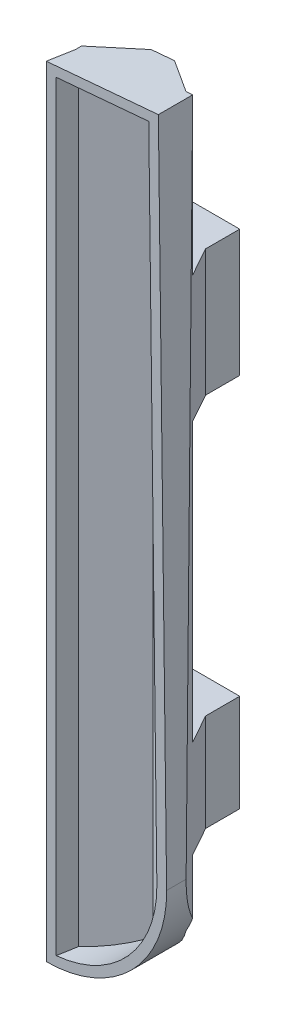
ISO-10303-21;
HEADER;
FILE_DESCRIPTION(('STEP AP214'),'2;1');
FILE_NAME('part.step','',(''),(''),'','','');
FILE_SCHEMA(('AUTOMOTIVE_DESIGN { 1 0 10303 214 1 1 1 1 }'));
ENDSEC;
DATA;
#1=APPLICATION_CONTEXT('core data for automotive mechanical design processes');
#2=APPLICATION_PROTOCOL_DEFINITION('international standard','automotive_design',2000,#1);
#3=PRODUCT_CONTEXT('',#1,'mechanical');
#4=PRODUCT('Part','Part','',(#3));
#5=PRODUCT_RELATED_PRODUCT_CATEGORY('part','',(#4));
#6=PRODUCT_DEFINITION_FORMATION('','',#4);
#7=PRODUCT_DEFINITION_CONTEXT('part definition',#1,'design');
#8=PRODUCT_DEFINITION('design','',#6,#7);
#9=PRODUCT_DEFINITION_SHAPE('','',#8);
#10=(LENGTH_UNIT() NAMED_UNIT(*) SI_UNIT(.MILLI.,.METRE.));
#11=(NAMED_UNIT(*) PLANE_ANGLE_UNIT() SI_UNIT($,.RADIAN.));
#12=(NAMED_UNIT(*) SI_UNIT($,.STERADIAN.) SOLID_ANGLE_UNIT());
#13=UNCERTAINTY_MEASURE_WITH_UNIT(LENGTH_MEASURE(1.E-05),#10,'distance_accuracy_value','');
#14=(GEOMETRIC_REPRESENTATION_CONTEXT(3) GLOBAL_UNCERTAINTY_ASSIGNED_CONTEXT((#13)) GLOBAL_UNIT_ASSIGNED_CONTEXT((#10,
#11,#12)) REPRESENTATION_CONTEXT('',''));
#15=CARTESIAN_POINT('',(0.,0.,0.));
#16=DIRECTION('',(0.,0.,1.));
#17=DIRECTION('',(1.,0.,0.));
#18=AXIS2_PLACEMENT_3D('',#15,#16,#17);
#19=CARTESIAN_POINT('',(1.,162.012239261096,-5.));
#20=DIRECTION('',(-1.,0.,0.));
#21=DIRECTION('',(0.,0.,1.));
#22=AXIS2_PLACEMENT_3D('',#19,#20,#21);
#23=PLANE('',#22);
#24=DIRECTION('',(0.,0.,-1.));
#25=VECTOR('',#24,1.);
#26=CARTESIAN_POINT('',(1.,27.0122392610962,-5.));
#27=LINE('',#26,#25);
#28=CARTESIAN_POINT('',(1.,27.0122392610962,-6.23485994175354));
#29=VERTEX_POINT('',#28);
#30=CARTESIAN_POINT('',(1.,27.0122392610962,-20.));
#31=VERTEX_POINT('',#30);
#32=EDGE_CURVE('E530',#29,#31,#27,.T.);
#33=ORIENTED_EDGE('',*,*,#32,.F.);
#34=DIRECTION('',(0.,1.,0.));
#35=VECTOR('',#34,1.);
#36=CARTESIAN_POINT('',(1.,0.,-6.23485994175354));
#37=LINE('',#36,#35);
#38=CARTESIAN_POINT('',(1.,0.0202554186842924,-6.23485994175354));
#39=VERTEX_POINT('',#38);
#40=EDGE_CURVE('E320',#39,#29,#37,.T.);
#41=ORIENTED_EDGE('',*,*,#40,.F.);
#42=DIRECTION('',(0.,0.,1.));
#43=VECTOR('',#42,1.);
#44=CARTESIAN_POINT('',(1.,0.0202554186842889,-20.));
#45=LINE('',#44,#43);
#46=CARTESIAN_POINT('',(1.,0.0202554186842785,-5.));
#47=VERTEX_POINT('',#46);
#48=EDGE_CURVE('E574',#47,#39,#45,.F.);
#49=ORIENTED_EDGE('',*,*,#48,.F.);
#50=DIRECTION('',(0.,-1.,0.));
#51=VECTOR('',#50,1.);
#52=CARTESIAN_POINT('',(1.,162.012239261096,-5.));
#53=LINE('',#52,#51);
#54=CARTESIAN_POINT('',(1.,160.087488663526,-5.));
#55=VERTEX_POINT('',#54);
#56=EDGE_CURVE('E556',#55,#47,#53,.T.);
#57=ORIENTED_EDGE('',*,*,#56,.F.);
#58=DIRECTION('',(0.,0.,1.));
#59=VECTOR('',#58,1.);
#60=CARTESIAN_POINT('',(1.,160.087488663526,-20.));
#61=LINE('',#60,#59);
#62=CARTESIAN_POINT('',(1.,160.087488663526,-6.23485994175354));
#63=VERTEX_POINT('',#62);
#64=EDGE_CURVE('E571',#63,#55,#61,.T.);
#65=ORIENTED_EDGE('',*,*,#64,.F.);
#66=DIRECTION('',(0.,-1.,0.));
#67=VECTOR('',#66,1.);
#68=CARTESIAN_POINT('',(1.,162.012264261096,-6.23485994175354));
#69=LINE('',#68,#67);
#70=CARTESIAN_POINT('',(1.,130.012239261096,-6.23485994175354));
#71=VERTEX_POINT('',#70);
#72=EDGE_CURVE('E389',#63,#71,#69,.T.);
#73=ORIENTED_EDGE('',*,*,#72,.T.);
#74=DIRECTION('',(0.,0.,1.));
#75=VECTOR('',#74,1.);
#76=CARTESIAN_POINT('',(1.,130.012239261096,-5.));
#77=LINE('',#76,#75);
#78=CARTESIAN_POINT('',(1.,130.012239261096,-20.));
#79=VERTEX_POINT('',#78);
#80=EDGE_CURVE('E552',#79,#71,#77,.T.);
#81=ORIENTED_EDGE('',*,*,#80,.F.);
#82=DIRECTION('',(0.,1.,0.));
#83=VECTOR('',#82,1.);
#84=CARTESIAN_POINT('',(1.,24.6948803571772,-20.));
#85=LINE('',#84,#83);
#86=CARTESIAN_POINT('',(1.,104.012239261096,-20.));
#87=VERTEX_POINT('',#86);
#88=EDGE_CURVE('E793',#87,#79,#85,.T.);
#89=ORIENTED_EDGE('',*,*,#88,.F.);
#90=DIRECTION('',(0.,0.,-1.));
#91=VECTOR('',#90,1.);
#92=CARTESIAN_POINT('',(1.,104.012239261096,-5.));
#93=LINE('',#92,#91);
#94=CARTESIAN_POINT('',(1.,104.012239261096,-6.23485994175354));
#95=VERTEX_POINT('',#94);
#96=EDGE_CURVE('E542',#95,#87,#93,.T.);
#97=ORIENTED_EDGE('',*,*,#96,.F.);
#98=DIRECTION('',(0.,-1.,0.));
#99=VECTOR('',#98,1.);
#100=CARTESIAN_POINT('',(1.,114.298896639428,-6.23485994175354));
#101=LINE('',#100,#99);
#102=CARTESIAN_POINT('',(1.,47.0122392610962,-6.23485994175354));
#103=VERTEX_POINT('',#102);
#104=EDGE_CURVE('E347',#95,#103,#101,.T.);
#105=ORIENTED_EDGE('',*,*,#104,.T.);
#106=DIRECTION('',(0.,0.,1.));
#107=VECTOR('',#106,1.);
#108=CARTESIAN_POINT('',(1.,47.0122392610962,-5.));
#109=LINE('',#108,#107);
#110=CARTESIAN_POINT('',(1.,47.0122392610962,-20.));
#111=VERTEX_POINT('',#110);
#112=EDGE_CURVE('E536',#111,#103,#109,.T.);
#113=ORIENTED_EDGE('',*,*,#112,.F.);
#114=EDGE_CURVE('E779',#31,#111,#85,.T.);
#115=ORIENTED_EDGE('',*,*,#114,.F.);
#116=EDGE_LOOP('',(#33,#41,#49,#57,#65,#73,#81,#89,#97,#105,#113,#115));
#117=FACE_BOUND('',#116,.T.);
#118=ADVANCED_FACE('F88',(#117),#23,.T.);
#119=CARTESIAN_POINT('',(19.6929953197027,162.012239261096,-13.));
#120=DIRECTION('',(0.874157276121538,0.,-0.485642931178632));
#121=DIRECTION('',(-0.485642931178632,0.,-0.874157276121538));
#122=AXIS2_PLACEMENT_3D('',#119,#120,#121);
#123=PLANE('',#122);
#124=CARTESIAN_POINT('',(0.,24.6948803571772,-48.4473915754649));
#125=DIRECTION('',(0.874157276121538,0.,-0.485642931178632));
#126=DIRECTION('',(0.485642931178632,0.,0.874157276121538));
#127=AXIS2_PLACEMENT_3D('',#124,#125,#126);
#128=ELLIPSE('',#127,50.8498709066843,24.6948803571772);
#129=CARTESIAN_POINT('',(23.,15.7039340301604,-7.04739157546487));
#130=VERTEX_POINT('',#129);
#131=CARTESIAN_POINT('',(24.6929953197027,24.3897607143542,-4.));
#132=VERTEX_POINT('',#131);
#133=EDGE_CURVE('E325',#130,#132,#128,.F.);
#134=ORIENTED_EDGE('',*,*,#133,.F.);
#135=DIRECTION('',(0.,1.,0.));
#136=VECTOR('',#135,1.);
#137=CARTESIAN_POINT('',(23.,0.,-7.04739157546487));
#138=LINE('',#137,#136);
#139=CARTESIAN_POINT('',(23.,27.0122392610962,-7.04739157546487));
#140=VERTEX_POINT('',#139);
#141=EDGE_CURVE('E316',#130,#140,#138,.T.);
#142=ORIENTED_EDGE('',*,*,#141,.T.);
#143=DIRECTION('',(0.485642931178632,0.,0.874157276121538));
#144=VECTOR('',#143,1.);
#145=CARTESIAN_POINT('',(19.6929953197027,27.0122392610962,-13.));
#146=LINE('',#145,#144);
#147=CARTESIAN_POINT('',(19.6929953197027,27.0122392610962,-13.));
#148=VERTEX_POINT('',#147);
#149=EDGE_CURVE('E300',#148,#140,#146,.T.);
#150=ORIENTED_EDGE('',*,*,#149,.F.);
#151=DIRECTION('',(0.,-1.,0.));
#152=VECTOR('',#151,1.);
#153=CARTESIAN_POINT('',(19.6929953197027,162.012239261096,-13.));
#154=LINE('',#153,#152);
#155=CARTESIAN_POINT('',(19.6929953197027,47.0122392610962,-13.));
#156=VERTEX_POINT('',#155);
#157=EDGE_CURVE('E555',#156,#148,#154,.T.);
#158=ORIENTED_EDGE('',*,*,#157,.F.);
#159=DIRECTION('',(-0.485642931178632,0.,-0.874157276121538));
#160=VECTOR('',#159,1.);
#161=CARTESIAN_POINT('',(19.6929953197027,47.0122392610962,-13.));
#162=LINE('',#161,#160);
#163=CARTESIAN_POINT('',(23.,47.0122392610962,-7.04739157546487));
#164=VERTEX_POINT('',#163);
#165=EDGE_CURVE('E311',#164,#156,#162,.T.);
#166=ORIENTED_EDGE('',*,*,#165,.F.);
#167=DIRECTION('',(0.,-1.,0.));
#168=VECTOR('',#167,1.);
#169=CARTESIAN_POINT('',(23.,114.298896639428,-7.04739157546487));
#170=LINE('',#169,#168);
#171=CARTESIAN_POINT('',(23.,104.012239261096,-7.04739157546487));
#172=VERTEX_POINT('',#171);
#173=EDGE_CURVE('E352',#172,#164,#170,.T.);
#174=ORIENTED_EDGE('',*,*,#173,.F.);
#175=DIRECTION('',(0.485642931178632,0.,0.874157276121538));
#176=VECTOR('',#175,1.);
#177=CARTESIAN_POINT('',(19.6929953197027,104.012239261096,-13.));
#178=LINE('',#177,#176);
#179=CARTESIAN_POINT('',(19.6929953197027,104.012239261096,-13.));
#180=VERTEX_POINT('',#179);
#181=EDGE_CURVE('E810',#180,#172,#178,.T.);
#182=ORIENTED_EDGE('',*,*,#181,.F.);
#183=CARTESIAN_POINT('',(19.6929953197027,130.012239261096,-13.));
#184=VERTEX_POINT('',#183);
#185=EDGE_CURVE('E561',#184,#180,#154,.T.);
#186=ORIENTED_EDGE('',*,*,#185,.F.);
#187=DIRECTION('',(-0.485642931178632,0.,-0.874157276121538));
#188=VECTOR('',#187,1.);
#189=CARTESIAN_POINT('',(19.6929953197027,130.012239261096,-13.));
#190=LINE('',#189,#188);
#191=CARTESIAN_POINT('',(23.,130.012239261096,-7.04739157546487));
#192=VERTEX_POINT('',#191);
#193=EDGE_CURVE('E756',#192,#184,#190,.T.);
#194=ORIENTED_EDGE('',*,*,#193,.F.);
#195=DIRECTION('',(0.,-1.,0.));
#196=VECTOR('',#195,1.);
#197=CARTESIAN_POINT('',(23.,162.012264261096,-7.04739157546487));
#198=LINE('',#197,#196);
#199=CARTESIAN_POINT('',(23.,162.012239261096,-7.04739157546487));
#200=VERTEX_POINT('',#199);
#201=EDGE_CURVE('E402',#200,#192,#198,.T.);
#202=ORIENTED_EDGE('',*,*,#201,.F.);
#203=DIRECTION('',(-0.012352528430367,0.999676467551096,-0.0222345511746607));
#204=VECTOR('',#203,1.);
#205=CARTESIAN_POINT('',(22.9964425282031,162.300141520089,-7.05379502469935));
#206=LINE('',#205,#204);
#207=CARTESIAN_POINT('',(24.6929953197027,25.0000000000002,-4.));
#208=VERTEX_POINT('',#207);
#209=EDGE_CURVE('E770',#208,#200,#206,.T.);
#210=ORIENTED_EDGE('',*,*,#209,.F.);
#211=CARTESIAN_POINT('',(0.,24.6948803571772,-4.));
#212=DIRECTION('',(0.,0.,1.));
#213=DIRECTION('',(0.999923666871545,-0.0123555829552469,0.));
#214=AXIS2_PLACEMENT_3D('',#211,#212,#213);
#215=CIRCLE('',#214,24.6948803571772);
#216=EDGE_CURVE('E312',#132,#208,#215,.T.);
#217=ORIENTED_EDGE('',*,*,#216,.F.);
#218=EDGE_LOOP('',(#134,#142,#150,#158,#166,#174,#182,#186,#194,#202,#210,#217));
#219=FACE_BOUND('',#218,.T.);
#220=ADVANCED_FACE('F323',(#219),#123,.T.);
#221=CARTESIAN_POINT('',(0.,24.6948803571772,-20.));
#222=DIRECTION('',(0.,0.,1.));
#223=DIRECTION('',(1.,0.,0.));
#224=AXIS2_PLACEMENT_3D('',#221,#222,#223);
#225=CYLINDRICAL_SURFACE('',#224,24.6948803571772);
#226=CARTESIAN_POINT('',(0.,24.6948803571772,-21.6865750091522));
#227=DIRECTION('',(0.560448340623305,0.,-0.828189385039789));
#228=DIRECTION('',(0.828189385039789,0.,0.560448340623305));
#229=AXIS2_PLACEMENT_3D('',#226,#227,#228);
#230=ELLIPSE('',#229,29.8179146017318,24.6948803571772);
#231=CARTESIAN_POINT('',(14.3141089347316,4.57167481581442,-12.));
#232=VERTEX_POINT('',#231);
#233=CARTESIAN_POINT('',(21.6327098264693,12.7842556288485,-7.04739157546487));
#234=VERTEX_POINT('',#233);
#235=EDGE_CURVE('E332',#232,#234,#230,.F.);
#236=ORIENTED_EDGE('',*,*,#235,.T.);
#237=CARTESIAN_POINT('',(0.,24.6948803571772,-7.04739157546487));
#238=DIRECTION('',(0.,0.,-1.));
#239=DIRECTION('',(-1.,0.,0.));
#240=AXIS2_PLACEMENT_3D('',#237,#238,#239);
#241=CIRCLE('',#240,24.6948803571772);
#242=EDGE_CURVE('E13',#234,#130,#241,.F.);
#243=ORIENTED_EDGE('',*,*,#242,.T.);
#244=ORIENTED_EDGE('',*,*,#133,.T.);
#245=ORIENTED_EDGE('',*,*,#216,.T.);
#246=DIRECTION('',(0.,0.,1.));
#247=VECTOR('',#246,1.);
#248=CARTESIAN_POINT('',(24.6929953197027,25.,-20.));
#249=LINE('',#248,#247);
#250=CARTESIAN_POINT('',(24.6929953197027,25.,0.));
#251=VERTEX_POINT('',#250);
#252=EDGE_CURVE('E780',#208,#251,#249,.T.);
#253=ORIENTED_EDGE('',*,*,#252,.T.);
#254=CARTESIAN_POINT('',(0.,24.6948803571772,0.));
#255=DIRECTION('',(0.,0.,1.));
#256=DIRECTION('',(-1.,0.,0.));
#257=AXIS2_PLACEMENT_3D('',#254,#255,#256);
#258=CIRCLE('',#257,24.6948803571772);
#259=CARTESIAN_POINT('',(0.,0.,0.));
#260=VERTEX_POINT('',#259);
#261=EDGE_CURVE('E584',#260,#251,#258,.T.);
#262=ORIENTED_EDGE('',*,*,#261,.F.);
#263=CARTESIAN_POINT('',(0.,24.6948803571772,0.));
#264=DIRECTION('',(-0.98058067569092,0.,-0.196116135138184));
#265=DIRECTION('',(-0.196116135138184,0.,0.98058067569092));
#266=AXIS2_PLACEMENT_3D('',#263,#264,#265);
#267=ELLIPSE('',#266,125.919676827085,24.6948803571772);
#268=EDGE_CURVE('E567',#260,#47,#267,.F.);
#269=ORIENTED_EDGE('',*,*,#268,.T.);
#270=ORIENTED_EDGE('',*,*,#48,.T.);
#271=CARTESIAN_POINT('',(0.,24.6948803571772,-5.55814474744279));
#272=DIRECTION('',(-0.560448340623305,0.,-0.828189385039789));
#273=DIRECTION('',(-0.828189385039789,0.,0.560448340623305));
#274=AXIS2_PLACEMENT_3D('',#271,#272,#273);
#275=ELLIPSE('',#274,29.8179146017318,24.6948803571772);
#276=CARTESIAN_POINT('',(9.51930044827551,1.90848014058402,-12.));
#277=VERTEX_POINT('',#276);
#278=EDGE_CURVE('E327',#39,#277,#275,.F.);
#279=ORIENTED_EDGE('',*,*,#278,.T.);
#280=CARTESIAN_POINT('',(0.,24.6948803571772,-12.));
#281=DIRECTION('',(0.,0.,-1.));
#282=DIRECTION('',(-1.,0.,0.));
#283=AXIS2_PLACEMENT_3D('',#280,#281,#282);
#284=CIRCLE('',#283,24.6948803571772);
#285=EDGE_CURVE('E517',#277,#232,#284,.F.);
#286=ORIENTED_EDGE('',*,*,#285,.T.);
#287=EDGE_LOOP('',(#236,#243,#244,#245,#253,#262,#269,#270,#279,#286));
#288=FACE_BOUND('',#287,.T.);
#289=ADVANCED_FACE('F90',(#288),#225,.T.);
#290=CARTESIAN_POINT('',(0.,24.6948803571772,-12.));
#291=DIRECTION('',(0.,0.,-1.));
#292=DIRECTION('',(-1.,0.,0.));
#293=AXIS2_PLACEMENT_3D('',#290,#291,#292);
#294=PLANE('',#293);
#295=DIRECTION('',(-1.,0.,0.));
#296=VECTOR('',#295,1.);
#297=CARTESIAN_POINT('',(0.,27.0122392610962,-12.));
#298=LINE('',#297,#296);
#299=CARTESIAN_POINT('',(14.3141089347316,27.0122392610962,-12.));
#300=VERTEX_POINT('',#299);
#301=CARTESIAN_POINT('',(9.51930044827551,27.0122392610962,-12.));
#302=VERTEX_POINT('',#301);
#303=EDGE_CURVE('E520',#300,#302,#298,.T.);
#304=ORIENTED_EDGE('',*,*,#303,.F.);
#305=DIRECTION('',(0.,-1.,0.));
#306=VECTOR('',#305,1.);
#307=CARTESIAN_POINT('',(14.3141089347316,24.6948803571772,-12.));
#308=LINE('',#307,#306);
#309=EDGE_CURVE('E98',#300,#232,#308,.T.);
#310=ORIENTED_EDGE('',*,*,#309,.T.);
#311=ORIENTED_EDGE('',*,*,#285,.F.);
#312=DIRECTION('',(0.,1.,0.));
#313=VECTOR('',#312,1.);
#314=CARTESIAN_POINT('',(9.51930044827552,24.6948803571772,-12.));
#315=LINE('',#314,#313);
#316=EDGE_CURVE('E725',#277,#302,#315,.T.);
#317=ORIENTED_EDGE('',*,*,#316,.T.);
#318=EDGE_LOOP('',(#304,#310,#311,#317));
#319=FACE_BOUND('',#318,.T.);
#320=ADVANCED_FACE('F636',(#319),#294,.T.);
#321=CARTESIAN_POINT('',(0.,24.6948803571772,-12.));
#322=DIRECTION('',(0.,0.,-1.));
#323=DIRECTION('',(-1.,0.,0.));
#324=AXIS2_PLACEMENT_3D('',#321,#322,#323);
#325=PLANE('',#324);
#326=DIRECTION('',(-1.,0.,0.));
#327=VECTOR('',#326,1.);
#328=CARTESIAN_POINT('',(0.,104.012239261096,-12.));
#329=LINE('',#328,#327);
#330=CARTESIAN_POINT('',(14.3141089347316,104.012239261096,-12.));
#331=VERTEX_POINT('',#330);
#332=CARTESIAN_POINT('',(9.51930044827551,104.012239261096,-12.));
#333=VERTEX_POINT('',#332);
#334=EDGE_CURVE('E502',#331,#333,#329,.T.);
#335=ORIENTED_EDGE('',*,*,#334,.F.);
#336=DIRECTION('',(0.,-1.,0.));
#337=VECTOR('',#336,1.);
#338=CARTESIAN_POINT('',(14.3141089347316,114.298896639428,-12.));
#339=LINE('',#338,#337);
#340=CARTESIAN_POINT('',(14.3141089347316,47.0122392610962,-12.));
#341=VERTEX_POINT('',#340);
#342=EDGE_CURVE('E113',#331,#341,#339,.T.);
#343=ORIENTED_EDGE('',*,*,#342,.T.);
#344=DIRECTION('',(1.,0.,0.));
#345=VECTOR('',#344,1.);
#346=CARTESIAN_POINT('',(24.4210005092669,47.0122392610962,-12.));
#347=LINE('',#346,#345);
#348=CARTESIAN_POINT('',(9.51930044827551,47.0122392610962,-12.));
#349=VERTEX_POINT('',#348);
#350=EDGE_CURVE('E506',#349,#341,#347,.T.);
#351=ORIENTED_EDGE('',*,*,#350,.F.);
#352=DIRECTION('',(0.,-1.,0.));
#353=VECTOR('',#352,1.);
#354=CARTESIAN_POINT('',(9.51930044827551,114.298896639428,-12.));
#355=LINE('',#354,#353);
#356=EDGE_CURVE('E378',#333,#349,#355,.T.);
#357=ORIENTED_EDGE('',*,*,#356,.F.);
#358=EDGE_LOOP('',(#335,#343,#351,#357));
#359=FACE_BOUND('',#358,.T.);
#360=ADVANCED_FACE('F616',(#359),#325,.T.);
#361=CARTESIAN_POINT('',(0.,160.,-20.));
#362=DIRECTION('',(-0.0871557427476547,0.996194698091746,0.));
#363=DIRECTION('',(-0.996194698091746,-0.0871557427476547,0.));
#364=AXIS2_PLACEMENT_3D('',#361,#362,#363);
#365=PLANE('',#364);
#366=DIRECTION('',(-0.996194698091746,-0.0871557427476547,0.));
#367=VECTOR('',#366,1.);
#368=CARTESIAN_POINT('',(0.,160.,-12.));
#369=LINE('',#368,#367);
#370=CARTESIAN_POINT('',(14.3141089347316,161.252322260264,-12.));
#371=VERTEX_POINT('',#370);
#372=CARTESIAN_POINT('',(9.51930044827551,160.832830873921,-12.));
#373=VERTEX_POINT('',#372);
#374=EDGE_CURVE('E545',#371,#373,#369,.T.);
#375=ORIENTED_EDGE('',*,*,#374,.T.);
#376=DIRECTION('',(-0.826023892953568,-0.0722677264349857,0.5589829192254));
#377=VECTOR('',#376,1.);
#378=CARTESIAN_POINT('',(6.66828471894549,160.583399318071,-10.0706743367434));
#379=LINE('',#378,#377);
#380=EDGE_CURVE('E411',#373,#63,#379,.T.);
#381=ORIENTED_EDGE('',*,*,#380,.T.);
#382=ORIENTED_EDGE('',*,*,#64,.T.);
#383=DIRECTION('',(-0.196087273719876,-0.0171554135121933,0.980436368599376));
#384=VECTOR('',#383,1.);
#385=CARTESIAN_POINT('',(3.84502189148934,160.336395826514,-19.2251094574466));
#386=LINE('',#385,#384);
#387=CARTESIAN_POINT('',(0.,160.,0.));
#388=VERTEX_POINT('',#387);
#389=EDGE_CURVE('E560',#55,#388,#386,.T.);
#390=ORIENTED_EDGE('',*,*,#389,.T.);
#391=DIRECTION('',(-0.996194698091746,-0.0871557427476547,0.));
#392=VECTOR('',#391,1.);
#393=CARTESIAN_POINT('',(0.,160.,0.));
#394=LINE('',#393,#392);
#395=CARTESIAN_POINT('',(23.,162.012239261096,0.));
#396=VERTEX_POINT('',#395);
#397=EDGE_CURVE('E832',#396,#388,#394,.T.);
#398=ORIENTED_EDGE('',*,*,#397,.F.);
#399=DIRECTION('',(0.,0.,1.));
#400=VECTOR('',#399,1.);
#401=CARTESIAN_POINT('',(23.,162.012239261096,-20.));
#402=LINE('',#401,#400);
#403=EDGE_CURVE('E783',#200,#396,#402,.T.);
#404=ORIENTED_EDGE('',*,*,#403,.F.);
#405=DIRECTION('',(-0.996194698091746,-0.0871557427476547,0.));
#406=VECTOR('',#405,1.);
#407=CARTESIAN_POINT('',(0.,160.,-7.04739157546487));
#408=LINE('',#407,#406);
#409=CARTESIAN_POINT('',(21.6327098264693,161.892616871162,-7.04739157546487));
#410=VERTEX_POINT('',#409);
#411=EDGE_CURVE('E415',#200,#410,#408,.T.);
#412=ORIENTED_EDGE('',*,*,#411,.T.);
#413=DIRECTION('',(-0.826023892953568,-0.0722677264349857,-0.5589829192254));
#414=VECTOR('',#413,1.);
#415=CARTESIAN_POINT('',(0.778747755340748,160.068131600339,-21.1595845705777));
#416=LINE('',#415,#414);
#417=EDGE_CURVE('E394',#410,#371,#416,.T.);
#418=ORIENTED_EDGE('',*,*,#417,.T.);
#419=EDGE_LOOP('',(#375,#381,#382,#390,#398,#404,#412,#418));
#420=FACE_BOUND('',#419,.T.);
#421=ADVANCED_FACE('F613',(#420),#365,.T.);
#422=CARTESIAN_POINT('',(0.,24.6948803571772,-12.));
#423=DIRECTION('',(0.,0.,-1.));
#424=DIRECTION('',(-1.,0.,0.));
#425=AXIS2_PLACEMENT_3D('',#422,#423,#424);
#426=PLANE('',#425);
#427=DIRECTION('',(1.,0.,0.));
#428=VECTOR('',#427,1.);
#429=CARTESIAN_POINT('',(23.3954088373612,130.012239261096,-12.));
#430=LINE('',#429,#428);
#431=CARTESIAN_POINT('',(9.51930044827551,130.012239261096,-12.));
#432=VERTEX_POINT('',#431);
#433=CARTESIAN_POINT('',(14.3141089347316,130.012239261096,-12.));
#434=VERTEX_POINT('',#433);
#435=EDGE_CURVE('E501',#432,#434,#430,.T.);
#436=ORIENTED_EDGE('',*,*,#435,.F.);
#437=DIRECTION('',(0.,1.,0.));
#438=VECTOR('',#437,1.);
#439=CARTESIAN_POINT('',(9.51930044827552,24.6948803571772,-12.));
#440=LINE('',#439,#438);
#441=EDGE_CURVE('E747',#432,#373,#440,.T.);
#442=ORIENTED_EDGE('',*,*,#441,.T.);
#443=ORIENTED_EDGE('',*,*,#374,.F.);
#444=DIRECTION('',(0.,-1.,0.));
#445=VECTOR('',#444,1.);
#446=CARTESIAN_POINT('',(14.3141089347316,24.6948803571772,-12.));
#447=LINE('',#446,#445);
#448=EDGE_CURVE('E751',#371,#434,#447,.T.);
#449=ORIENTED_EDGE('',*,*,#448,.T.);
#450=EDGE_LOOP('',(#436,#442,#443,#449));
#451=FACE_BOUND('',#450,.T.);
#452=ADVANCED_FACE('F615',(#451),#426,.T.);
#453=CARTESIAN_POINT('',(0.,24.6948803571772,-20.));
#454=DIRECTION('',(0.,0.,1.));
#455=DIRECTION('',(1.,0.,0.));
#456=AXIS2_PLACEMENT_3D('',#453,#454,#455);
#457=CYLINDRICAL_SURFACE('',#456,22.6948803571772);
#458=CARTESIAN_POINT('',(0.,24.6948803571772,-3.83506825314362));
#459=DIRECTION('',(0.,0.,-1.));
#460=DIRECTION('',(-1.,0.,0.));
#461=AXIS2_PLACEMENT_3D('',#458,#459,#460);
#462=CIRCLE('',#461,22.6948803571772);
#463=CARTESIAN_POINT('',(22.496706258848,21.7022557683429,-3.83506825314363));
#464=VERTEX_POINT('',#463);
#465=CARTESIAN_POINT('',(21.0267879269413,16.1548695900865,-3.83506825314363));
#466=VERTEX_POINT('',#465);
#467=EDGE_CURVE('E420',#464,#466,#462,.T.);
#468=ORIENTED_EDGE('',*,*,#467,.T.);
#469=CARTESIAN_POINT('',(0.,24.6948803571772,-18.0642151308547));
#470=DIRECTION('',(-0.560448340623305,0.,0.828189385039789));
#471=DIRECTION('',(0.828189385039789,0.,0.560448340623305));
#472=AXIS2_PLACEMENT_3D('',#469,#470,#471);
#473=ELLIPSE('',#472,27.4030080162001,22.6948803571772);
#474=CARTESIAN_POINT('',(11.9167046915036,5.38038466813358,-10.));
#475=VERTEX_POINT('',#474);
#476=EDGE_CURVE('E446',#475,#466,#473,.T.);
#477=ORIENTED_EDGE('',*,*,#476,.F.);
#478=CARTESIAN_POINT('',(0.,24.6948803571772,-1.9357848691453));
#479=DIRECTION('',(0.560448340623305,0.,0.828189385039789));
#480=DIRECTION('',(-0.828189385039789,0.,0.560448340623305));
#481=AXIS2_PLACEMENT_3D('',#478,#479,#480);
#482=ELLIPSE('',#481,27.4030080162001,22.6948803571772);
#483=CARTESIAN_POINT('',(2.80662145606585,2.17421272877555,-3.83506825314368));
#484=VERTEX_POINT('',#483);
#485=EDGE_CURVE('E434',#484,#475,#482,.T.);
#486=ORIENTED_EDGE('',*,*,#485,.F.);
#487=CARTESIAN_POINT('',(0.,24.6948803571772,10.1980390271856));
#488=DIRECTION('',(-0.98058067569092,0.,-0.196116135138184));
#489=DIRECTION('',(-0.196116135138184,0.,0.98058067569092));
#490=AXIS2_PLACEMENT_3D('',#487,#488,#489);
#491=ELLIPSE('',#490,115.7216377999,22.6948803571772);
#492=CARTESIAN_POINT('',(2.03960780543711,2.09183643768292,0.));
#493=VERTEX_POINT('',#492);
#494=EDGE_CURVE('E462',#493,#484,#491,.F.);
#495=ORIENTED_EDGE('',*,*,#494,.F.);
#496=CARTESIAN_POINT('',(0.,24.6948803571772,0.));
#497=DIRECTION('',(0.,0.,-1.));
#498=DIRECTION('',(-1.,0.,0.));
#499=AXIS2_PLACEMENT_3D('',#496,#497,#498);
#500=CIRCLE('',#499,22.6948803571772);
#501=CARTESIAN_POINT('',(22.6931479859596,24.9752888340895,0.));
#502=VERTEX_POINT('',#501);
#503=EDGE_CURVE('E461',#493,#502,#500,.F.);
#504=ORIENTED_EDGE('',*,*,#503,.T.);
#505=DIRECTION('',(0.,0.,1.));
#506=VECTOR('',#505,1.);
#507=CARTESIAN_POINT('',(22.6931479859596,24.9752888340895,-20.));
#508=LINE('',#507,#506);
#509=CARTESIAN_POINT('',(22.6931479859596,24.9752888340895,-3.48147314434276));
#510=VERTEX_POINT('',#509);
#511=EDGE_CURVE('E469',#510,#502,#508,.T.);
#512=ORIENTED_EDGE('',*,*,#511,.F.);
#513=CARTESIAN_POINT('',(0.,24.6948803571772,-44.3291395190701));
#514=DIRECTION('',(0.874157276121538,0.,-0.485642931178632));
#515=DIRECTION('',(0.485642931178632,0.,0.874157276121538));
#516=AXIS2_PLACEMENT_3D('',#513,#514,#515);
#517=ELLIPSE('',#516,46.7316188502895,22.6948803571772);
#518=CARTESIAN_POINT('',(22.6930092953783,24.4034639086672,-3.48172278738916));
#519=VERTEX_POINT('',#518);
#520=EDGE_CURVE('E463',#519,#510,#517,.F.);
#521=ORIENTED_EDGE('',*,*,#520,.F.);
#522=CARTESIAN_POINT('',(0.,24.6948803571772,-44.3291395190701));
#523=DIRECTION('',(0.874157276121538,0.,-0.485642931178632));
#524=DIRECTION('',(0.485642931178632,0.,0.874157276121538));
#525=AXIS2_PLACEMENT_3D('',#522,#523,#524);
#526=ELLIPSE('',#525,46.7316188502895,22.6948803571772);
#527=EDGE_CURVE('E458',#464,#519,#526,.F.);
#528=ORIENTED_EDGE('',*,*,#527,.F.);
#529=EDGE_LOOP('',(#468,#477,#486,#495,#504,#512,#521,#528));
#530=FACE_BOUND('',#529,.T.);
#531=ADVANCED_FACE('F656',(#530),#457,.F.);
#532=CARTESIAN_POINT('',(21.0001526662569,161.987528095186,-20.));
#533=DIRECTION('',(0.999923666871545,0.0123555829552388,0.));
#534=DIRECTION('',(-0.0123555829552388,0.999923666871545,0.));
#535=AXIS2_PLACEMENT_3D('',#532,#533,#534);
#536=PLANE('',#535);
#537=DIRECTION('',(0.0123555829552388,-0.999923666871545,0.));
#538=VECTOR('',#537,1.);
#539=CARTESIAN_POINT('',(21.0273482048304,159.786623228821,-3.83506825314363));
#540=LINE('',#539,#538);
#541=CARTESIAN_POINT('',(21.0267879269413,159.831965898884,-3.83506825314363));
#542=VERTEX_POINT('',#541);
#543=CARTESIAN_POINT('',(22.496706258848,40.8731006015795,-3.83506825314362));
#544=VERTEX_POINT('',#543);
#545=EDGE_CURVE('E419',#542,#544,#540,.T.);
#546=ORIENTED_EDGE('',*,*,#545,.T.);
#547=DIRECTION('',(-0.012352528430367,0.999676467551096,-0.0222345511746607));
#548=VECTOR('',#547,1.);
#549=CARTESIAN_POINT('',(20.9964527795421,162.286955836011,-6.53552451589427));
#550=LINE('',#549,#548);
#551=EDGE_CURVE('E468',#510,#544,#550,.T.);
#552=ORIENTED_EDGE('',*,*,#551,.F.);
#553=ORIENTED_EDGE('',*,*,#511,.T.);
#554=DIRECTION('',(-0.0123555829552388,0.999923666871545,0.));
#555=VECTOR('',#554,1.);
#556=CARTESIAN_POINT('',(21.0001526662569,161.987528095186,0.));
#557=LINE('',#556,#555);
#558=CARTESIAN_POINT('',(21.0267879269413,159.831965898884,0.));
#559=VERTEX_POINT('',#558);
#560=EDGE_CURVE('E487',#502,#559,#557,.T.);
#561=ORIENTED_EDGE('',*,*,#560,.T.);
#562=DIRECTION('',(0.,0.,1.));
#563=VECTOR('',#562,1.);
#564=CARTESIAN_POINT('',(21.0267879269413,159.831965898884,-20.));
#565=LINE('',#564,#563);
#566=EDGE_CURVE('E472',#542,#559,#565,.T.);
#567=ORIENTED_EDGE('',*,*,#566,.F.);
#568=EDGE_LOOP('',(#546,#552,#553,#561,#567));
#569=FACE_BOUND('',#568,.T.);
#570=ADVANCED_FACE('F660',(#569),#536,.F.);
#571=CARTESIAN_POINT('',(17.9446807674596,162.012239261096,-12.0287141376427));
#572=DIRECTION('',(0.874157276121538,0.,-0.485642931178632));
#573=DIRECTION('',(-0.485642931178632,0.,-0.874157276121538));
#574=AXIS2_PLACEMENT_3D('',#571,#572,#573);
#575=PLANE('',#574);
#576=DIRECTION('',(0.,-1.,0.));
#577=VECTOR('',#576,1.);
#578=CARTESIAN_POINT('',(22.496706258848,159.831965898884,-3.83506825314363));
#579=LINE('',#578,#577);
#580=EDGE_CURVE('E425',#544,#464,#579,.T.);
#581=ORIENTED_EDGE('',*,*,#580,.T.);
#582=ORIENTED_EDGE('',*,*,#527,.T.);
#583=ORIENTED_EDGE('',*,*,#520,.T.);
#584=ORIENTED_EDGE('',*,*,#551,.T.);
#585=EDGE_LOOP('',(#581,#582,#583,#584));
#586=FACE_BOUND('',#585,.T.);
#587=ADVANCED_FACE('F611',(#586),#575,.F.);
#588=CARTESIAN_POINT('',(0.,24.6948803571772,0.));
#589=DIRECTION('',(0.,0.,-1.));
#590=DIRECTION('',(-1.,0.,0.));
#591=AXIS2_PLACEMENT_3D('',#588,#589,#590);
#592=PLANE('',#591);
#593=ORIENTED_EDGE('',*,*,#261,.T.);
#594=DIRECTION('',(-0.0123555829552388,0.999923666871545,0.));
#595=VECTOR('',#594,1.);
#596=CARTESIAN_POINT('',(23.,162.012239261096,0.));
#597=LINE('',#596,#595);
#598=EDGE_CURVE('E839',#251,#396,#597,.T.);
#599=ORIENTED_EDGE('',*,*,#598,.T.);
#600=ORIENTED_EDGE('',*,*,#397,.T.);
#601=DIRECTION('',(0.,-1.,0.));
#602=VECTOR('',#601,1.);
#603=CARTESIAN_POINT('',(0.,0.,0.));
#604=LINE('',#603,#602);
#605=EDGE_CURVE('E738',#388,#260,#604,.T.);
#606=ORIENTED_EDGE('',*,*,#605,.T.);
#607=EDGE_LOOP('',(#593,#599,#600,#606));
#608=FACE_BOUND('',#607,.T.);
#609=ORIENTED_EDGE('',*,*,#503,.F.);
#610=DIRECTION('',(0.,-1.,0.));
#611=VECTOR('',#610,1.);
#612=CARTESIAN_POINT('',(2.03960780543711,162.012239261096,0.));
#613=LINE('',#612,#611);
#614=CARTESIAN_POINT('',(2.03960780543711,158.170802885928,0.));
#615=VERTEX_POINT('',#614);
#616=EDGE_CURVE('E473',#615,#493,#613,.T.);
#617=ORIENTED_EDGE('',*,*,#616,.F.);
#618=DIRECTION('',(-0.996194698091746,-0.0871557427476547,0.));
#619=VECTOR('',#618,1.);
#620=CARTESIAN_POINT('',(0.174311485495309,158.007610603817,0.));
#621=LINE('',#620,#619);
#622=EDGE_CURVE('E491',#559,#615,#621,.T.);
#623=ORIENTED_EDGE('',*,*,#622,.F.);
#624=ORIENTED_EDGE('',*,*,#560,.F.);
#625=EDGE_LOOP('',(#609,#617,#623,#624));
#626=FACE_BOUND('',#625,.T.);
#627=ADVANCED_FACE('F608',(#608,#626),#592,.F.);
#628=CARTESIAN_POINT('',(0.,24.6948803571772,-20.));
#629=DIRECTION('',(0.,0.,-1.));
#630=DIRECTION('',(-1.,0.,0.));
#631=AXIS2_PLACEMENT_3D('',#628,#629,#630);
#632=PLANE('',#631);
#633=DIRECTION('',(-1.,0.,0.));
#634=VECTOR('',#633,1.);
#635=CARTESIAN_POINT('',(23.3954088373612,130.012239261096,-20.));
#636=LINE('',#635,#634);
#637=CARTESIAN_POINT('',(19.6929953197027,130.012239261096,-20.));
#638=VERTEX_POINT('',#637);
#639=EDGE_CURVE('E498',#638,#79,#636,.T.);
#640=ORIENTED_EDGE('',*,*,#639,.F.);
#641=DIRECTION('',(0.,-1.,0.));
#642=VECTOR('',#641,1.);
#643=CARTESIAN_POINT('',(19.6929953197027,24.6948803571772,-20.));
#644=LINE('',#643,#642);
#645=CARTESIAN_POINT('',(19.6929953197027,104.012239261096,-20.));
#646=VERTEX_POINT('',#645);
#647=EDGE_CURVE('E792',#638,#646,#644,.T.);
#648=ORIENTED_EDGE('',*,*,#647,.T.);
#649=DIRECTION('',(1.,0.,0.));
#650=VECTOR('',#649,1.);
#651=CARTESIAN_POINT('',(0.,104.012239261096,-20.));
#652=LINE('',#651,#650);
#653=EDGE_CURVE('E514',#87,#646,#652,.T.);
#654=ORIENTED_EDGE('',*,*,#653,.F.);
#655=ORIENTED_EDGE('',*,*,#88,.T.);
#656=EDGE_LOOP('',(#640,#648,#654,#655));
#657=FACE_BOUND('',#656,.T.);
#658=ADVANCED_FACE('F607',(#657),#632,.T.);
#659=CARTESIAN_POINT('',(19.6929953197027,162.012239261096,-13.));
#660=DIRECTION('',(1.,0.,0.));
#661=DIRECTION('',(0.,0.,-1.));
#662=AXIS2_PLACEMENT_3D('',#659,#660,#661);
#663=PLANE('',#662);
#664=DIRECTION('',(0.,0.,-1.));
#665=VECTOR('',#664,1.);
#666=CARTESIAN_POINT('',(19.6929953197027,130.012239261096,-13.));
#667=LINE('',#666,#665);
#668=EDGE_CURVE('E549',#184,#638,#667,.T.);
#669=ORIENTED_EDGE('',*,*,#668,.F.);
#670=ORIENTED_EDGE('',*,*,#185,.T.);
#671=DIRECTION('',(0.,0.,1.));
#672=VECTOR('',#671,1.);
#673=CARTESIAN_POINT('',(19.6929953197027,104.012239261096,-13.));
#674=LINE('',#673,#672);
#675=EDGE_CURVE('E539',#646,#180,#674,.T.);
#676=ORIENTED_EDGE('',*,*,#675,.F.);
#677=ORIENTED_EDGE('',*,*,#647,.F.);
#678=EDGE_LOOP('',(#669,#670,#676,#677));
#679=FACE_BOUND('',#678,.T.);
#680=ADVANCED_FACE('F601',(#679),#663,.T.);
#681=CARTESIAN_POINT('',(23.,162.012239261096,-20.));
#682=DIRECTION('',(0.999923666871545,0.0123555829552388,0.));
#683=DIRECTION('',(-0.0123555829552388,0.999923666871545,0.));
#684=AXIS2_PLACEMENT_3D('',#681,#682,#683);
#685=PLANE('',#684);
#686=ORIENTED_EDGE('',*,*,#252,.F.);
#687=ORIENTED_EDGE('',*,*,#209,.T.);
#688=ORIENTED_EDGE('',*,*,#403,.T.);
#689=ORIENTED_EDGE('',*,*,#598,.F.);
#690=EDGE_LOOP('',(#686,#687,#688,#689));
#691=FACE_BOUND('',#690,.T.);
#692=ADVANCED_FACE('F605',(#691),#685,.T.);
#693=DIRECTION('',(-1.,0.,0.));
#694=VECTOR('',#693,1.);
#695=CARTESIAN_POINT('',(24.4210005092669,47.0122392610962,-20.));
#696=LINE('',#695,#694);
#697=CARTESIAN_POINT('',(19.6929953197027,47.0122392610962,-20.));
#698=VERTEX_POINT('',#697);
#699=EDGE_CURVE('E510',#698,#111,#696,.T.);
#700=ORIENTED_EDGE('',*,*,#699,.F.);
#701=CARTESIAN_POINT('',(19.6929953197027,27.0122392610962,-20.));
#702=VERTEX_POINT('',#701);
#703=EDGE_CURVE('E789',#698,#702,#644,.T.);
#704=ORIENTED_EDGE('',*,*,#703,.T.);
#705=DIRECTION('',(1.,0.,0.));
#706=VECTOR('',#705,1.);
#707=CARTESIAN_POINT('',(0.,27.0122392610962,-20.));
#708=LINE('',#707,#706);
#709=EDGE_CURVE('E467',#31,#702,#708,.T.);
#710=ORIENTED_EDGE('',*,*,#709,.F.);
#711=ORIENTED_EDGE('',*,*,#114,.T.);
#712=EDGE_LOOP('',(#700,#704,#710,#711));
#713=FACE_BOUND('',#712,.T.);
#714=ADVANCED_FACE('F602',(#713),#632,.T.);
#715=CARTESIAN_POINT('',(0.,162.012239261096,0.));
#716=DIRECTION('',(-0.98058067569092,0.,-0.196116135138184));
#717=DIRECTION('',(-0.196116135138184,0.,0.98058067569092));
#718=AXIS2_PLACEMENT_3D('',#715,#716,#717);
#719=PLANE('',#718);
#720=ORIENTED_EDGE('',*,*,#605,.F.);
#721=ORIENTED_EDGE('',*,*,#389,.F.);
#722=ORIENTED_EDGE('',*,*,#56,.T.);
#723=ORIENTED_EDGE('',*,*,#268,.F.);
#724=EDGE_LOOP('',(#720,#721,#722,#723));
#725=FACE_BOUND('',#724,.T.);
#726=ADVANCED_FACE('F595',(#725),#719,.T.);
#727=DIRECTION('',(0.,0.,-1.));
#728=VECTOR('',#727,1.);
#729=CARTESIAN_POINT('',(19.6929953197027,47.0122392610962,-13.));
#730=LINE('',#729,#728);
#731=EDGE_CURVE('E533',#156,#698,#730,.T.);
#732=ORIENTED_EDGE('',*,*,#731,.F.);
#733=ORIENTED_EDGE('',*,*,#157,.T.);
#734=DIRECTION('',(0.,0.,1.));
#735=VECTOR('',#734,1.);
#736=CARTESIAN_POINT('',(19.6929953197027,27.0122392610962,-13.));
#737=LINE('',#736,#735);
#738=EDGE_CURVE('E305',#702,#148,#737,.T.);
#739=ORIENTED_EDGE('',*,*,#738,.F.);
#740=ORIENTED_EDGE('',*,*,#703,.F.);
#741=EDGE_LOOP('',(#732,#733,#739,#740));
#742=FACE_BOUND('',#741,.T.);
#743=ADVANCED_FACE('F597',(#742),#663,.T.);
#744=CARTESIAN_POINT('',(0.,27.0122392610962,62.0111704926912));
#745=DIRECTION('',(0.,1.,0.));
#746=DIRECTION('',(0.,0.,1.));
#747=AXIS2_PLACEMENT_3D('',#744,#745,#746);
#748=PLANE('',#747);
#749=ORIENTED_EDGE('',*,*,#32,.T.);
#750=ORIENTED_EDGE('',*,*,#709,.T.);
#751=ORIENTED_EDGE('',*,*,#738,.T.);
#752=ORIENTED_EDGE('',*,*,#149,.T.);
#753=DIRECTION('',(-1.,0.,0.));
#754=VECTOR('',#753,1.);
#755=CARTESIAN_POINT('',(23.,27.0122392610962,-7.04739157546487));
#756=LINE('',#755,#754);
#757=CARTESIAN_POINT('',(21.6327098264693,27.0122392610962,-7.04739157546487));
#758=VERTEX_POINT('',#757);
#759=EDGE_CURVE('E303',#140,#758,#756,.T.);
#760=ORIENTED_EDGE('',*,*,#759,.T.);
#761=DIRECTION('',(-0.828189385039789,0.,-0.560448340623305));
#762=VECTOR('',#761,1.);
#763=CARTESIAN_POINT('',(21.6327098264693,27.0122392610962,-7.04739157546487));
#764=LINE('',#763,#762);
#765=EDGE_CURVE('E105',#758,#300,#764,.T.);
#766=ORIENTED_EDGE('',*,*,#765,.T.);
#767=ORIENTED_EDGE('',*,*,#303,.T.);
#768=DIRECTION('',(-0.828189385039789,0.,0.560448340623305));
#769=VECTOR('',#768,1.);
#770=CARTESIAN_POINT('',(9.51930044827551,27.0122392610962,-12.));
#771=LINE('',#770,#769);
#772=EDGE_CURVE('E337',#302,#29,#771,.T.);
#773=ORIENTED_EDGE('',*,*,#772,.T.);
#774=EDGE_LOOP('',(#749,#750,#751,#752,#760,#766,#767,#773));
#775=FACE_BOUND('',#774,.T.);
#776=ADVANCED_FACE('F302',(#775),#748,.F.);
#777=CARTESIAN_POINT('',(0.,104.012239261096,62.0111704926912));
#778=DIRECTION('',(0.,1.,0.));
#779=DIRECTION('',(0.,0.,1.));
#780=AXIS2_PLACEMENT_3D('',#777,#778,#779);
#781=PLANE('',#780);
#782=ORIENTED_EDGE('',*,*,#96,.T.);
#783=ORIENTED_EDGE('',*,*,#653,.T.);
#784=ORIENTED_EDGE('',*,*,#675,.T.);
#785=ORIENTED_EDGE('',*,*,#181,.T.);
#786=DIRECTION('',(1.,0.,0.));
#787=VECTOR('',#786,1.);
#788=CARTESIAN_POINT('',(21.6327098264693,104.012239261096,-7.04739157546487));
#789=LINE('',#788,#787);
#790=CARTESIAN_POINT('',(21.6327098264693,104.012239261096,-7.04739157546487));
#791=VERTEX_POINT('',#790);
#792=EDGE_CURVE('E358',#791,#172,#789,.T.);
#793=ORIENTED_EDGE('',*,*,#792,.F.);
#794=DIRECTION('',(0.828189385039789,0.,0.560448340623305));
#795=VECTOR('',#794,1.);
#796=CARTESIAN_POINT('',(14.3141089347316,104.012239261096,-12.));
#797=LINE('',#796,#795);
#798=EDGE_CURVE('E363',#331,#791,#797,.T.);
#799=ORIENTED_EDGE('',*,*,#798,.F.);
#800=ORIENTED_EDGE('',*,*,#334,.T.);
#801=DIRECTION('',(0.828189385039789,0.,-0.560448340623305));
#802=VECTOR('',#801,1.);
#803=CARTESIAN_POINT('',(1.,104.012239261096,-6.23485994175354));
#804=LINE('',#803,#802);
#805=EDGE_CURVE('E368',#95,#333,#804,.T.);
#806=ORIENTED_EDGE('',*,*,#805,.F.);
#807=EDGE_LOOP('',(#782,#783,#784,#785,#793,#799,#800,#806));
#808=FACE_BOUND('',#807,.T.);
#809=ADVANCED_FACE('F635',(#808),#781,.F.);
#810=CARTESIAN_POINT('',(24.4210005092669,47.0122392610962,62.0111704926912));
#811=DIRECTION('',(0.,-1.,0.));
#812=DIRECTION('',(0.,0.,-1.));
#813=AXIS2_PLACEMENT_3D('',#810,#811,#812);
#814=PLANE('',#813);
#815=ORIENTED_EDGE('',*,*,#112,.T.);
#816=DIRECTION('',(0.828189385039789,0.,-0.560448340623305));
#817=VECTOR('',#816,1.);
#818=CARTESIAN_POINT('',(1.,47.0122392610962,-6.23485994175354));
#819=LINE('',#818,#817);
#820=EDGE_CURVE('E374',#103,#349,#819,.T.);
#821=ORIENTED_EDGE('',*,*,#820,.T.);
#822=ORIENTED_EDGE('',*,*,#350,.T.);
#823=DIRECTION('',(0.828189385039789,0.,0.560448340623305));
#824=VECTOR('',#823,1.);
#825=CARTESIAN_POINT('',(14.3141089347316,47.0122392610962,-12.));
#826=LINE('',#825,#824);
#827=CARTESIAN_POINT('',(21.6327098264693,47.0122392610962,-7.04739157546487));
#828=VERTEX_POINT('',#827);
#829=EDGE_CURVE('E354',#341,#828,#826,.T.);
#830=ORIENTED_EDGE('',*,*,#829,.T.);
#831=DIRECTION('',(1.,0.,0.));
#832=VECTOR('',#831,1.);
#833=CARTESIAN_POINT('',(21.6327098264693,47.0122392610962,-7.04739157546487));
#834=LINE('',#833,#832);
#835=EDGE_CURVE('E348',#828,#164,#834,.T.);
#836=ORIENTED_EDGE('',*,*,#835,.T.);
#837=ORIENTED_EDGE('',*,*,#165,.T.);
#838=ORIENTED_EDGE('',*,*,#731,.T.);
#839=ORIENTED_EDGE('',*,*,#699,.T.);
#840=EDGE_LOOP('',(#815,#821,#822,#830,#836,#837,#838,#839));
#841=FACE_BOUND('',#840,.T.);
#842=ADVANCED_FACE('F642',(#841),#814,.F.);
#843=CARTESIAN_POINT('',(23.3954088373612,130.012239261096,62.0111704926912));
#844=DIRECTION('',(0.,-1.,0.));
#845=DIRECTION('',(0.,0.,-1.));
#846=AXIS2_PLACEMENT_3D('',#843,#844,#845);
#847=PLANE('',#846);
#848=ORIENTED_EDGE('',*,*,#80,.T.);
#849=DIRECTION('',(0.828189385039789,0.,-0.560448340623305));
#850=VECTOR('',#849,1.);
#851=CARTESIAN_POINT('',(1.,130.012239261096,-6.23485994175354));
#852=LINE('',#851,#850);
#853=EDGE_CURVE('E386',#71,#432,#852,.T.);
#854=ORIENTED_EDGE('',*,*,#853,.T.);
#855=ORIENTED_EDGE('',*,*,#435,.T.);
#856=DIRECTION('',(0.828189385039789,0.,0.560448340623305));
#857=VECTOR('',#856,1.);
#858=CARTESIAN_POINT('',(14.3141089347316,130.012239261096,-12.));
#859=LINE('',#858,#857);
#860=CARTESIAN_POINT('',(21.6327098264693,130.012239261096,-7.04739157546487));
#861=VERTEX_POINT('',#860);
#862=EDGE_CURVE('E362',#434,#861,#859,.T.);
#863=ORIENTED_EDGE('',*,*,#862,.T.);
#864=DIRECTION('',(1.,0.,0.));
#865=VECTOR('',#864,1.);
#866=CARTESIAN_POINT('',(23.,130.012239261096,-7.04739157546487));
#867=LINE('',#866,#865);
#868=EDGE_CURVE('E398',#861,#192,#867,.T.);
#869=ORIENTED_EDGE('',*,*,#868,.T.);
#870=ORIENTED_EDGE('',*,*,#193,.T.);
#871=ORIENTED_EDGE('',*,*,#668,.T.);
#872=ORIENTED_EDGE('',*,*,#639,.T.);
#873=EDGE_LOOP('',(#848,#854,#855,#863,#869,#870,#871,#872));
#874=FACE_BOUND('',#873,.T.);
#875=ADVANCED_FACE('F646',(#874),#847,.F.);
#876=CARTESIAN_POINT('',(0.174311485495309,158.007610603817,-20.));
#877=DIRECTION('',(-0.0871557427476547,0.996194698091746,0.));
#878=DIRECTION('',(-0.996194698091746,-0.0871557427476547,0.));
#879=AXIS2_PLACEMENT_3D('',#876,#877,#878);
#880=PLANE('',#879);
#881=DIRECTION('',(-0.196087273719876,-0.0171554135121933,0.980436368599376));
#882=VECTOR('',#881,1.);
#883=CARTESIAN_POINT('',(5.81235967305733,158.500875904641,-18.863759338101));
#884=LINE('',#883,#882);
#885=CARTESIAN_POINT('',(2.80662145606584,158.237907885128,-3.83506825314363));
#886=VERTEX_POINT('',#885);
#887=EDGE_CURVE('E450',#886,#615,#884,.T.);
#888=ORIENTED_EDGE('',*,*,#887,.F.);
#889=DIRECTION('',(0.826023892953569,0.0722677264349857,-0.5589829192254));
#890=VECTOR('',#889,1.);
#891=CARTESIAN_POINT('',(8.46069449432512,158.732575178723,-7.66126538787645));
#892=LINE('',#891,#890);
#893=CARTESIAN_POINT('',(11.9167046915036,159.034936892006,-10.));
#894=VERTEX_POINT('',#893);
#895=EDGE_CURVE('E438',#886,#894,#892,.T.);
#896=ORIENTED_EDGE('',*,*,#895,.T.);
#897=DIRECTION('',(0.826023892953569,0.0722677264349857,0.558982919225399));
#898=VECTOR('',#897,1.);
#899=CARTESIAN_POINT('',(9.08477214157593,158.787174898017,-11.9164117857992));
#900=LINE('',#899,#898);
#901=EDGE_CURVE('E441',#894,#542,#900,.T.);
#902=ORIENTED_EDGE('',*,*,#901,.T.);
#903=ORIENTED_EDGE('',*,*,#566,.T.);
#904=ORIENTED_EDGE('',*,*,#622,.T.);
#905=EDGE_LOOP('',(#888,#896,#902,#903,#904));
#906=FACE_BOUND('',#905,.T.);
#907=ADVANCED_FACE('F653',(#906),#880,.F.);
#908=CARTESIAN_POINT('',(1.96116135138184,162.012239261096,0.392232270276369));
#909=DIRECTION('',(-0.98058067569092,0.,-0.196116135138184));
#910=DIRECTION('',(-0.196116135138184,0.,0.98058067569092));
#911=AXIS2_PLACEMENT_3D('',#908,#909,#910);
#912=PLANE('',#911);
#913=ORIENTED_EDGE('',*,*,#494,.T.);
#914=DIRECTION('',(0.,1.,0.));
#915=VECTOR('',#914,1.);
#916=CARTESIAN_POINT('',(2.80662145606584,-0.001000000000001,-3.83506825314363));
#917=LINE('',#916,#915);
#918=EDGE_CURVE('E424',#484,#886,#917,.T.);
#919=ORIENTED_EDGE('',*,*,#918,.T.);
#920=ORIENTED_EDGE('',*,*,#887,.T.);
#921=ORIENTED_EDGE('',*,*,#616,.T.);
#922=EDGE_LOOP('',(#913,#919,#920,#921));
#923=FACE_BOUND('',#922,.T.);
#924=ADVANCED_FACE('F662',(#923),#912,.F.);
#925=CARTESIAN_POINT('',(8.38463852424422,-0.001000000000001,-12.3902028426953));
#926=DIRECTION('',(-0.560448340623305,0.,0.828189385039789));
#927=DIRECTION('',(0.828189385039789,0.,0.560448340623305));
#928=AXIS2_PLACEMENT_3D('',#925,#926,#927);
#929=PLANE('',#928);
#930=DIRECTION('',(0.,1.,0.));
#931=VECTOR('',#930,1.);
#932=CARTESIAN_POINT('',(11.9167046915036,-0.001000000000001,-10.));
#933=LINE('',#932,#931);
#934=EDGE_CURVE('E445',#475,#894,#933,.T.);
#935=ORIENTED_EDGE('',*,*,#934,.F.);
#936=ORIENTED_EDGE('',*,*,#476,.T.);
#937=DIRECTION('',(0.,1.,0.));
#938=VECTOR('',#937,1.);
#939=CARTESIAN_POINT('',(21.0267879269413,-0.001000000000001,-3.83506825314363));
#940=LINE('',#939,#938);
#941=EDGE_CURVE('E451',#466,#542,#940,.T.);
#942=ORIENTED_EDGE('',*,*,#941,.T.);
#943=ORIENTED_EDGE('',*,*,#901,.F.);
#944=EDGE_LOOP('',(#935,#936,#942,#943));
#945=FACE_BOUND('',#944,.T.);
#946=ADVANCED_FACE('F665',(#945),#929,.T.);
#947=CARTESIAN_POINT('',(-0.898508807103473,-0.001000000000001,-1.32775030715635));
#948=DIRECTION('',(0.560448340623305,0.,0.828189385039789));
#949=DIRECTION('',(0.828189385039789,0.,-0.560448340623305));
#950=AXIS2_PLACEMENT_3D('',#947,#948,#949);
#951=PLANE('',#950);
#952=ORIENTED_EDGE('',*,*,#895,.F.);
#953=ORIENTED_EDGE('',*,*,#918,.F.);
#954=ORIENTED_EDGE('',*,*,#485,.T.);
#955=ORIENTED_EDGE('',*,*,#934,.T.);
#956=EDGE_LOOP('',(#952,#953,#954,#955));
#957=FACE_BOUND('',#956,.T.);
#958=ADVANCED_FACE('F678',(#957),#951,.T.);
#959=CARTESIAN_POINT('',(24.6968803571772,159.831965898884,-3.83506825314363));
#960=DIRECTION('',(0.,0.,-1.));
#961=DIRECTION('',(-1.,0.,0.));
#962=AXIS2_PLACEMENT_3D('',#959,#960,#961);
#963=PLANE('',#962);
#964=ORIENTED_EDGE('',*,*,#545,.F.);
#965=ORIENTED_EDGE('',*,*,#941,.F.);
#966=ORIENTED_EDGE('',*,*,#467,.F.);
#967=ORIENTED_EDGE('',*,*,#580,.F.);
#968=EDGE_LOOP('',(#964,#965,#966,#967));
#969=FACE_BOUND('',#968,.T.);
#970=ADVANCED_FACE('F682',(#969),#963,.F.);
#971=CARTESIAN_POINT('',(14.3141089347316,162.012264261096,-12.));
#972=DIRECTION('',(0.560448340623305,0.,-0.828189385039789));
#973=DIRECTION('',(-0.828189385039789,0.,-0.560448340623305));
#974=AXIS2_PLACEMENT_3D('',#971,#972,#973);
#975=PLANE('',#974);
#976=DIRECTION('',(0.,-1.,0.));
#977=VECTOR('',#976,1.);
#978=CARTESIAN_POINT('',(21.6327098264693,162.012264261096,-7.04739157546487));
#979=LINE('',#978,#977);
#980=EDGE_CURVE('E390',#410,#861,#979,.T.);
#981=ORIENTED_EDGE('',*,*,#980,.T.);
#982=ORIENTED_EDGE('',*,*,#862,.F.);
#983=ORIENTED_EDGE('',*,*,#448,.F.);
#984=ORIENTED_EDGE('',*,*,#417,.F.);
#985=EDGE_LOOP('',(#981,#982,#983,#984));
#986=FACE_BOUND('',#985,.T.);
#987=ADVANCED_FACE('F686',(#986),#975,.T.);
#988=CARTESIAN_POINT('',(23.,162.012264261096,-7.04739157546487));
#989=DIRECTION('',(0.,0.,-1.));
#990=DIRECTION('',(-1.,0.,0.));
#991=AXIS2_PLACEMENT_3D('',#988,#989,#990);
#992=PLANE('',#991);
#993=ORIENTED_EDGE('',*,*,#201,.T.);
#994=ORIENTED_EDGE('',*,*,#868,.F.);
#995=ORIENTED_EDGE('',*,*,#980,.F.);
#996=ORIENTED_EDGE('',*,*,#411,.F.);
#997=EDGE_LOOP('',(#993,#994,#995,#996));
#998=FACE_BOUND('',#997,.T.);
#999=ADVANCED_FACE('F690',(#998),#992,.T.);
#1000=CARTESIAN_POINT('',(1.,162.012264261096,-6.23485994175354));
#1001=DIRECTION('',(-0.560448340623305,0.,-0.828189385039789));
#1002=DIRECTION('',(-0.828189385039789,0.,0.560448340623305));
#1003=AXIS2_PLACEMENT_3D('',#1000,#1001,#1002);
#1004=PLANE('',#1003);
#1005=ORIENTED_EDGE('',*,*,#441,.F.);
#1006=ORIENTED_EDGE('',*,*,#853,.F.);
#1007=ORIENTED_EDGE('',*,*,#72,.F.);
#1008=ORIENTED_EDGE('',*,*,#380,.F.);
#1009=EDGE_LOOP('',(#1005,#1006,#1007,#1008));
#1010=FACE_BOUND('',#1009,.T.);
#1011=ADVANCED_FACE('F694',(#1010),#1004,.T.);
#1012=CARTESIAN_POINT('',(1.,114.298896639428,-6.23485994175354));
#1013=DIRECTION('',(-0.560448340623305,0.,-0.828189385039789));
#1014=DIRECTION('',(-0.828189385039789,0.,0.560448340623305));
#1015=AXIS2_PLACEMENT_3D('',#1012,#1013,#1014);
#1016=PLANE('',#1015);
#1017=ORIENTED_EDGE('',*,*,#805,.T.);
#1018=ORIENTED_EDGE('',*,*,#356,.T.);
#1019=ORIENTED_EDGE('',*,*,#820,.F.);
#1020=ORIENTED_EDGE('',*,*,#104,.F.);
#1021=EDGE_LOOP('',(#1017,#1018,#1019,#1020));
#1022=FACE_BOUND('',#1021,.T.);
#1023=ADVANCED_FACE('F698',(#1022),#1016,.T.);
#1024=CARTESIAN_POINT('',(14.3141089347316,114.298896639428,-12.));
#1025=DIRECTION('',(0.560448340623305,0.,-0.828189385039789));
#1026=DIRECTION('',(-0.828189385039789,0.,-0.560448340623305));
#1027=AXIS2_PLACEMENT_3D('',#1024,#1025,#1026);
#1028=PLANE('',#1027);
#1029=ORIENTED_EDGE('',*,*,#798,.T.);
#1030=DIRECTION('',(0.,-1.,0.));
#1031=VECTOR('',#1030,1.);
#1032=CARTESIAN_POINT('',(21.6327098264693,114.298896639428,-7.04739157546487));
#1033=LINE('',#1032,#1031);
#1034=EDGE_CURVE('E353',#791,#828,#1033,.T.);
#1035=ORIENTED_EDGE('',*,*,#1034,.T.);
#1036=ORIENTED_EDGE('',*,*,#829,.F.);
#1037=ORIENTED_EDGE('',*,*,#342,.F.);
#1038=EDGE_LOOP('',(#1029,#1035,#1036,#1037));
#1039=FACE_BOUND('',#1038,.T.);
#1040=ADVANCED_FACE('F702',(#1039),#1028,.T.);
#1041=CARTESIAN_POINT('',(21.6327098264693,114.298896639428,-7.04739157546487));
#1042=DIRECTION('',(0.,0.,-1.));
#1043=DIRECTION('',(-1.,0.,0.));
#1044=AXIS2_PLACEMENT_3D('',#1041,#1042,#1043);
#1045=PLANE('',#1044);
#1046=ORIENTED_EDGE('',*,*,#792,.T.);
#1047=ORIENTED_EDGE('',*,*,#173,.T.);
#1048=ORIENTED_EDGE('',*,*,#835,.F.);
#1049=ORIENTED_EDGE('',*,*,#1034,.F.);
#1050=EDGE_LOOP('',(#1046,#1047,#1048,#1049));
#1051=FACE_BOUND('',#1050,.T.);
#1052=ADVANCED_FACE('F706',(#1051),#1045,.T.);
#1053=CARTESIAN_POINT('',(9.51930044827551,0.,-12.));
#1054=DIRECTION('',(-0.560448340623305,0.,-0.828189385039789));
#1055=DIRECTION('',(-0.828189385039789,0.,0.560448340623305));
#1056=AXIS2_PLACEMENT_3D('',#1053,#1054,#1055);
#1057=PLANE('',#1056);
#1058=ORIENTED_EDGE('',*,*,#40,.T.);
#1059=ORIENTED_EDGE('',*,*,#772,.F.);
#1060=ORIENTED_EDGE('',*,*,#316,.F.);
#1061=ORIENTED_EDGE('',*,*,#278,.F.);
#1062=EDGE_LOOP('',(#1058,#1059,#1060,#1061));
#1063=FACE_BOUND('',#1062,.T.);
#1064=ADVANCED_FACE('F709',(#1063),#1057,.T.);
#1065=CARTESIAN_POINT('',(23.,0.,-7.04739157546487));
#1066=DIRECTION('',(0.,0.,-1.));
#1067=DIRECTION('',(-1.,0.,0.));
#1068=AXIS2_PLACEMENT_3D('',#1065,#1066,#1067);
#1069=PLANE('',#1068);
#1070=DIRECTION('',(0.,1.,0.));
#1071=VECTOR('',#1070,1.);
#1072=CARTESIAN_POINT('',(21.6327098264693,0.,-7.04739157546487));
#1073=LINE('',#1072,#1071);
#1074=EDGE_CURVE('E318',#234,#758,#1073,.T.);
#1075=ORIENTED_EDGE('',*,*,#1074,.T.);
#1076=ORIENTED_EDGE('',*,*,#759,.F.);
#1077=ORIENTED_EDGE('',*,*,#141,.F.);
#1078=ORIENTED_EDGE('',*,*,#242,.F.);
#1079=EDGE_LOOP('',(#1075,#1076,#1077,#1078));
#1080=FACE_BOUND('',#1079,.T.);
#1081=ADVANCED_FACE('F315',(#1080),#1069,.T.);
#1082=CARTESIAN_POINT('',(21.6327098264693,0.,-7.04739157546487));
#1083=DIRECTION('',(0.560448340623305,0.,-0.828189385039789));
#1084=DIRECTION('',(-0.828189385039789,0.,-0.560448340623305));
#1085=AXIS2_PLACEMENT_3D('',#1082,#1083,#1084);
#1086=PLANE('',#1085);
#1087=ORIENTED_EDGE('',*,*,#309,.F.);
#1088=ORIENTED_EDGE('',*,*,#765,.F.);
#1089=ORIENTED_EDGE('',*,*,#1074,.F.);
#1090=ORIENTED_EDGE('',*,*,#235,.F.);
#1091=EDGE_LOOP('',(#1087,#1088,#1089,#1090));
#1092=FACE_BOUND('',#1091,.T.);
#1093=ADVANCED_FACE('F716',(#1092),#1086,.T.);
#1094=CLOSED_SHELL('',(#118,#220,#289,#320,#360,#421,#452,#531,#570,#587,#627,#658,#680,#692,
#714,#726,#743,#776,#809,#842,#875,#907,#924,#946,#958,#970,#987,#999,#1011,#1023,#1040,#1052,
#1064,#1081,#1093));
#1095=MANIFOLD_SOLID_BREP('B2',#1094);
#1096=ADVANCED_BREP_SHAPE_REPRESENTATION('',(#18,#1095),#14);
#1097=SHAPE_DEFINITION_REPRESENTATION(#9,#1096);
ENDSEC;
END-ISO-10303-21;
